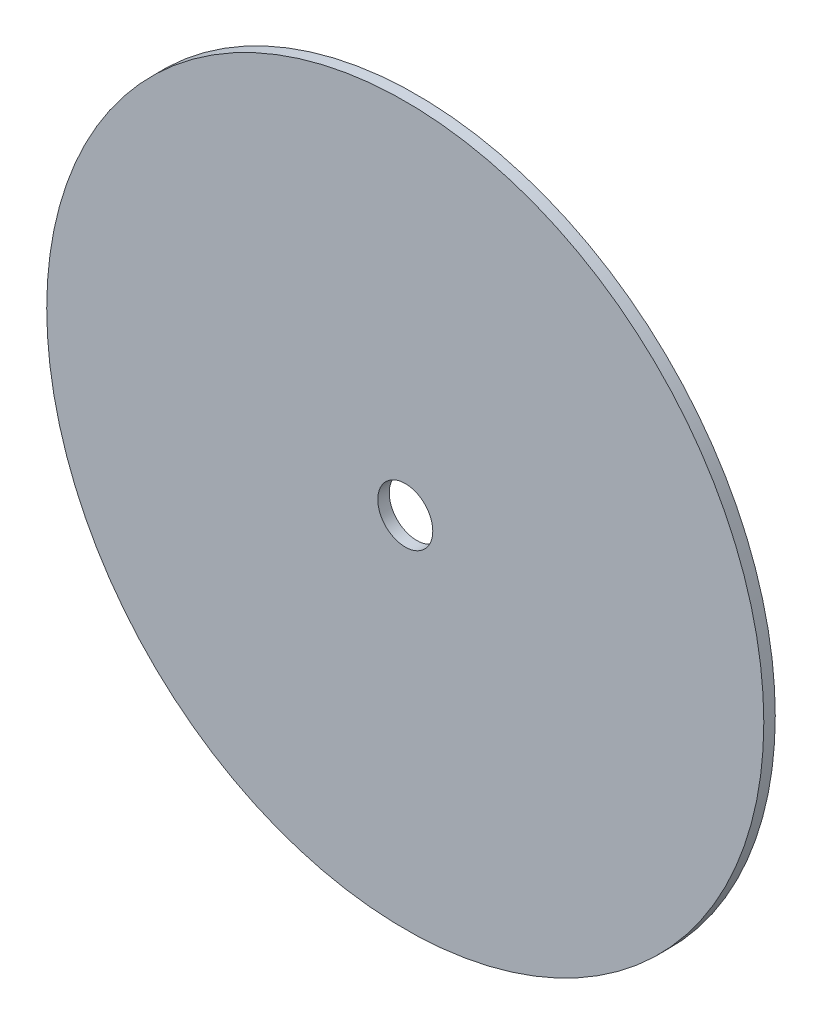
ISO-10303-21;
HEADER;
FILE_DESCRIPTION(('STEP AP214'),'2;1');
FILE_NAME('part.step','',(''),(''),'','','');
FILE_SCHEMA(('AUTOMOTIVE_DESIGN { 1 0 10303 214 1 1 1 1 }'));
ENDSEC;
DATA;
#1=APPLICATION_CONTEXT('core data for automotive mechanical design processes');
#2=APPLICATION_PROTOCOL_DEFINITION('international standard','automotive_design',2000,#1);
#3=PRODUCT_CONTEXT('',#1,'mechanical');
#4=PRODUCT('Part','Part','',(#3));
#5=PRODUCT_RELATED_PRODUCT_CATEGORY('part','',(#4));
#6=PRODUCT_DEFINITION_FORMATION('','',#4);
#7=PRODUCT_DEFINITION_CONTEXT('part definition',#1,'design');
#8=PRODUCT_DEFINITION('design','',#6,#7);
#9=PRODUCT_DEFINITION_SHAPE('','',#8);
#10=(LENGTH_UNIT() NAMED_UNIT(*) SI_UNIT(.MILLI.,.METRE.));
#11=(NAMED_UNIT(*) PLANE_ANGLE_UNIT() SI_UNIT($,.RADIAN.));
#12=(NAMED_UNIT(*) SI_UNIT($,.STERADIAN.) SOLID_ANGLE_UNIT());
#13=UNCERTAINTY_MEASURE_WITH_UNIT(LENGTH_MEASURE(1.E-05),#10,'distance_accuracy_value','');
#14=(GEOMETRIC_REPRESENTATION_CONTEXT(3) GLOBAL_UNCERTAINTY_ASSIGNED_CONTEXT((#13)) GLOBAL_UNIT_ASSIGNED_CONTEXT((#10,
#11,#12)) REPRESENTATION_CONTEXT('',''));
#15=CARTESIAN_POINT('',(0.,0.,0.));
#16=DIRECTION('',(0.,0.,1.));
#17=DIRECTION('',(1.,0.,0.));
#18=AXIS2_PLACEMENT_3D('',#15,#16,#17);
#19=CARTESIAN_POINT('',(0.,0.,1.5875));
#20=DIRECTION('',(0.,0.,1.));
#21=DIRECTION('',(1.,0.,0.));
#22=AXIS2_PLACEMENT_3D('',#19,#20,#21);
#23=PLANE('',#22);
#24=CARTESIAN_POINT('',(0.,0.,1.5875));
#25=DIRECTION('',(0.,0.,1.));
#26=DIRECTION('',(1.,0.,0.));
#27=AXIS2_PLACEMENT_3D('',#24,#25,#26);
#28=CIRCLE('',#27,49.657);
#29=CARTESIAN_POINT('',(49.657,0.,1.5875));
#30=VERTEX_POINT('',#29);
#31=EDGE_CURVE('E10',#30,#30,#28,.T.);
#32=ORIENTED_EDGE('',*,*,#31,.T.);
#33=EDGE_LOOP('',(#32));
#34=FACE_BOUND('',#33,.T.);
#35=CARTESIAN_POINT('',(0.,0.,1.5875));
#36=DIRECTION('',(0.,0.,1.));
#37=DIRECTION('',(1.,0.,0.));
#38=AXIS2_PLACEMENT_3D('',#35,#36,#37);
#39=CIRCLE('',#38,3.81);
#40=CARTESIAN_POINT('',(3.81,0.,1.5875));
#41=VERTEX_POINT('',#40);
#42=EDGE_CURVE('E48',#41,#41,#39,.T.);
#43=ORIENTED_EDGE('',*,*,#42,.F.);
#44=EDGE_LOOP('',(#43));
#45=FACE_BOUND('',#44,.T.);
#46=ADVANCED_FACE('F40',(#34,#45),#23,.T.);
#47=CARTESIAN_POINT('',(0.,0.,0.));
#48=DIRECTION('',(0.,0.,1.));
#49=DIRECTION('',(1.,0.,0.));
#50=AXIS2_PLACEMENT_3D('',#47,#48,#49);
#51=PLANE('',#50);
#52=CARTESIAN_POINT('',(0.,0.,0.));
#53=DIRECTION('',(0.,0.,1.));
#54=DIRECTION('',(1.,0.,0.));
#55=AXIS2_PLACEMENT_3D('',#52,#53,#54);
#56=CIRCLE('',#55,49.657);
#57=CARTESIAN_POINT('',(49.657,0.,0.));
#58=VERTEX_POINT('',#57);
#59=EDGE_CURVE('E41',#58,#58,#56,.T.);
#60=ORIENTED_EDGE('',*,*,#59,.F.);
#61=EDGE_LOOP('',(#60));
#62=FACE_BOUND('',#61,.T.);
#63=CARTESIAN_POINT('',(0.,0.,0.));
#64=DIRECTION('',(0.,0.,1.));
#65=DIRECTION('',(1.,0.,0.));
#66=AXIS2_PLACEMENT_3D('',#63,#64,#65);
#67=CIRCLE('',#66,3.81);
#68=CARTESIAN_POINT('',(3.81,0.,0.));
#69=VERTEX_POINT('',#68);
#70=EDGE_CURVE('E49',#69,#69,#67,.T.);
#71=ORIENTED_EDGE('',*,*,#70,.T.);
#72=EDGE_LOOP('',(#71));
#73=FACE_BOUND('',#72,.T.);
#74=ADVANCED_FACE('F58',(#62,#73),#51,.F.);
#75=CARTESIAN_POINT('',(0.,0.,1.5875));
#76=DIRECTION('',(0.,0.,-1.));
#77=DIRECTION('',(-1.,0.,0.));
#78=AXIS2_PLACEMENT_3D('',#75,#76,#77);
#79=CYLINDRICAL_SURFACE('',#78,49.657);
#80=ORIENTED_EDGE('',*,*,#31,.F.);
#81=EDGE_LOOP('',(#80));
#82=FACE_BOUND('',#81,.T.);
#83=ORIENTED_EDGE('',*,*,#59,.T.);
#84=EDGE_LOOP('',(#83));
#85=FACE_BOUND('',#84,.T.);
#86=ADVANCED_FACE('F39',(#82,#85),#79,.T.);
#87=CARTESIAN_POINT('',(0.,0.,1.5875));
#88=DIRECTION('',(0.,0.,-1.));
#89=DIRECTION('',(-1.,0.,0.));
#90=AXIS2_PLACEMENT_3D('',#87,#88,#89);
#91=CYLINDRICAL_SURFACE('',#90,3.81);
#92=ORIENTED_EDGE('',*,*,#42,.T.);
#93=EDGE_LOOP('',(#92));
#94=FACE_BOUND('',#93,.T.);
#95=ORIENTED_EDGE('',*,*,#70,.F.);
#96=EDGE_LOOP('',(#95));
#97=FACE_BOUND('',#96,.T.);
#98=ADVANCED_FACE('F57',(#94,#97),#91,.F.);
#99=CLOSED_SHELL('',(#46,#74,#86,#98));
#100=MANIFOLD_SOLID_BREP('B2',#99);
#101=ADVANCED_BREP_SHAPE_REPRESENTATION('',(#18,#100),#14);
#102=SHAPE_DEFINITION_REPRESENTATION(#9,#101);
ENDSEC;
END-ISO-10303-21;
